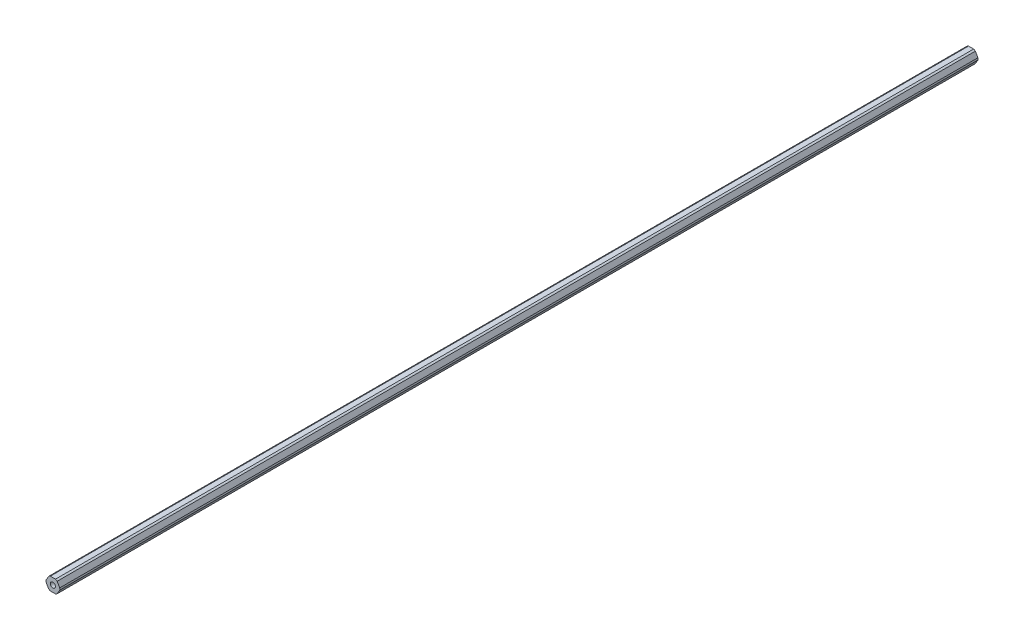
ISO-10303-21;
HEADER;
FILE_DESCRIPTION(('STEP AP214'),'2;1');
FILE_NAME('part.step','',(''),(''),'','','');
FILE_SCHEMA(('AUTOMOTIVE_DESIGN { 1 0 10303 214 1 1 1 1 }'));
ENDSEC;
DATA;
#1=APPLICATION_CONTEXT('core data for automotive mechanical design processes');
#2=APPLICATION_PROTOCOL_DEFINITION('international standard','automotive_design',2000,#1);
#3=PRODUCT_CONTEXT('',#1,'mechanical');
#4=PRODUCT('Part','Part','',(#3));
#5=PRODUCT_RELATED_PRODUCT_CATEGORY('part','',(#4));
#6=PRODUCT_DEFINITION_FORMATION('','',#4);
#7=PRODUCT_DEFINITION_CONTEXT('part definition',#1,'design');
#8=PRODUCT_DEFINITION('design','',#6,#7);
#9=PRODUCT_DEFINITION_SHAPE('','',#8);
#10=(LENGTH_UNIT() NAMED_UNIT(*) SI_UNIT(.MILLI.,.METRE.));
#11=(NAMED_UNIT(*) PLANE_ANGLE_UNIT() SI_UNIT($,.RADIAN.));
#12=(NAMED_UNIT(*) SI_UNIT($,.STERADIAN.) SOLID_ANGLE_UNIT());
#13=UNCERTAINTY_MEASURE_WITH_UNIT(LENGTH_MEASURE(1.E-05),#10,'distance_accuracy_value','');
#14=(GEOMETRIC_REPRESENTATION_CONTEXT(3) GLOBAL_UNCERTAINTY_ASSIGNED_CONTEXT((#13)) GLOBAL_UNIT_ASSIGNED_CONTEXT((#10,
#11,#12)) REPRESENTATION_CONTEXT('',''));
#15=CARTESIAN_POINT('',(0.,0.,0.));
#16=DIRECTION('',(0.,0.,1.));
#17=DIRECTION('',(1.,0.,0.));
#18=AXIS2_PLACEMENT_3D('',#15,#16,#17);
#19=CARTESIAN_POINT('',(0.,0.,-457.2));
#20=DIRECTION('',(0.,0.,1.));
#21=DIRECTION('',(1.,0.,0.));
#22=AXIS2_PLACEMENT_3D('',#19,#20,#21);
#23=CYLINDRICAL_SURFACE('',#22,6.87);
#24=DIRECTION('',(0.,0.,1.));
#25=VECTOR('',#24,1.);
#26=CARTESIAN_POINT('',(6.80102150534208,0.97108520937895,457.2));
#27=LINE('',#26,#25);
#28=CARTESIAN_POINT('',(6.80102150534208,0.971085209378948,-457.2));
#29=VERTEX_POINT('',#28);
#30=CARTESIAN_POINT('',(6.80102150534208,0.971085209378948,457.2));
#31=VERTEX_POINT('',#30);
#32=EDGE_CURVE('E123',#29,#31,#27,.T.);
#33=ORIENTED_EDGE('',*,*,#32,.T.);
#34=CARTESIAN_POINT('',(0.,0.,457.2));
#35=DIRECTION('',(0.,0.,1.));
#36=DIRECTION('',(1.,0.,0.));
#37=AXIS2_PLACEMENT_3D('',#34,#35,#36);
#38=CIRCLE('',#37,6.87);
#39=CARTESIAN_POINT('',(6.80102150534208,-0.971085209378954,457.2));
#40=VERTEX_POINT('',#39);
#41=EDGE_CURVE('E118',#31,#40,#38,.F.);
#42=ORIENTED_EDGE('',*,*,#41,.T.);
#43=DIRECTION('',(0.,0.,1.));
#44=VECTOR('',#43,1.);
#45=CARTESIAN_POINT('',(6.80102150534208,-0.971085209378955,457.2));
#46=LINE('',#45,#44);
#47=CARTESIAN_POINT('',(6.80102150534208,-0.971085209378953,-457.2));
#48=VERTEX_POINT('',#47);
#49=EDGE_CURVE('E120',#40,#48,#46,.F.);
#50=ORIENTED_EDGE('',*,*,#49,.T.);
#51=CARTESIAN_POINT('',(0.,0.,-457.2));
#52=DIRECTION('',(0.,0.,1.));
#53=DIRECTION('',(1.,0.,0.));
#54=AXIS2_PLACEMENT_3D('',#51,#52,#53);
#55=CIRCLE('',#54,6.87);
#56=EDGE_CURVE('E21',#48,#29,#55,.T.);
#57=ORIENTED_EDGE('',*,*,#56,.T.);
#58=EDGE_LOOP('',(#33,#42,#50,#57));
#59=FACE_BOUND('',#58,.T.);
#60=ADVANCED_FACE('F18',(#59),#23,.T.);
#61=CARTESIAN_POINT('',(3.68083890619154,6.3754,457.2));
#62=DIRECTION('',(0.,-1.,0.));
#63=DIRECTION('',(1.,0.,0.));
#64=AXIS2_PLACEMENT_3D('',#61,#62,#63);
#65=PLANE('',#64);
#66=DIRECTION('',(1.,0.,0.));
#67=VECTOR('',#66,1.);
#68=CARTESIAN_POINT('',(0.,6.3754,-457.2));
#69=LINE('',#68,#67);
#70=CARTESIAN_POINT('',(2.55952629210953,6.37540000000001,-457.2));
#71=VERTEX_POINT('',#70);
#72=CARTESIAN_POINT('',(-2.55952629210953,6.37540000000001,-457.2));
#73=VERTEX_POINT('',#72);
#74=EDGE_CURVE('E145',#71,#73,#69,.F.);
#75=ORIENTED_EDGE('',*,*,#74,.T.);
#76=DIRECTION('',(0.,0.,1.));
#77=VECTOR('',#76,1.);
#78=CARTESIAN_POINT('',(-2.55952629210953,6.37540000000001,-457.2));
#79=LINE('',#78,#77);
#80=CARTESIAN_POINT('',(-2.55952629210953,6.37540000000001,457.2));
#81=VERTEX_POINT('',#80);
#82=EDGE_CURVE('E128',#81,#73,#79,.F.);
#83=ORIENTED_EDGE('',*,*,#82,.F.);
#84=DIRECTION('',(1.,0.,0.));
#85=VECTOR('',#84,1.);
#86=CARTESIAN_POINT('',(0.,6.3754,457.2));
#87=LINE('',#86,#85);
#88=CARTESIAN_POINT('',(2.55952629210953,6.37540000000001,457.2));
#89=VERTEX_POINT('',#88);
#90=EDGE_CURVE('E167',#89,#81,#87,.F.);
#91=ORIENTED_EDGE('',*,*,#90,.F.);
#92=DIRECTION('',(0.,0.,1.));
#93=VECTOR('',#92,1.);
#94=CARTESIAN_POINT('',(2.55952629210953,6.37540000000001,-457.2));
#95=LINE('',#94,#93);
#96=EDGE_CURVE('E174',#71,#89,#95,.T.);
#97=ORIENTED_EDGE('',*,*,#96,.F.);
#98=EDGE_LOOP('',(#75,#83,#91,#97));
#99=FACE_BOUND('',#98,.T.);
#100=ADVANCED_FACE('F237',(#99),#65,.F.);
#101=CARTESIAN_POINT('',(0.,0.,-457.2));
#102=DIRECTION('',(0.,0.,1.));
#103=DIRECTION('',(1.,0.,0.));
#104=AXIS2_PLACEMENT_3D('',#101,#102,#103);
#105=CYLINDRICAL_SURFACE('',#104,6.87);
#106=DIRECTION('',(0.,0.,1.));
#107=VECTOR('',#106,1.);
#108=CARTESIAN_POINT('',(-4.24149521323255,5.40431479062104,457.2));
#109=LINE('',#108,#107);
#110=CARTESIAN_POINT('',(-4.24149521323255,5.40431479062105,-457.2));
#111=VERTEX_POINT('',#110);
#112=CARTESIAN_POINT('',(-4.24149521323255,5.40431479062105,457.2));
#113=VERTEX_POINT('',#112);
#114=EDGE_CURVE('E199',#111,#113,#109,.T.);
#115=ORIENTED_EDGE('',*,*,#114,.T.);
#116=CARTESIAN_POINT('',(0.,0.,457.2));
#117=DIRECTION('',(0.,0.,1.));
#118=DIRECTION('',(1.,0.,0.));
#119=AXIS2_PLACEMENT_3D('',#116,#117,#118);
#120=CIRCLE('',#119,6.87);
#121=EDGE_CURVE('E166',#81,#113,#120,.T.);
#122=ORIENTED_EDGE('',*,*,#121,.F.);
#123=ORIENTED_EDGE('',*,*,#82,.T.);
#124=CARTESIAN_POINT('',(0.,0.,-457.2));
#125=DIRECTION('',(0.,0.,1.));
#126=DIRECTION('',(1.,0.,0.));
#127=AXIS2_PLACEMENT_3D('',#124,#125,#126);
#128=CIRCLE('',#127,6.87);
#129=EDGE_CURVE('E150',#73,#111,#128,.T.);
#130=ORIENTED_EDGE('',*,*,#129,.T.);
#131=EDGE_LOOP('',(#115,#122,#123,#130));
#132=FACE_BOUND('',#131,.T.);
#133=ADVANCED_FACE('F241',(#132),#105,.T.);
#134=CARTESIAN_POINT('',(-3.68083890619154,6.3754,457.2));
#135=DIRECTION('',(0.866025403784439,-0.5,0.));
#136=DIRECTION('',(0.5,0.866025403784439,0.));
#137=AXIS2_PLACEMENT_3D('',#134,#135,#136);
#138=PLANE('',#137);
#139=DIRECTION('',(-0.5,-0.866025403784439,0.));
#140=VECTOR('',#139,1.);
#141=CARTESIAN_POINT('',(-4.24149521323255,5.40431479062104,-457.2));
#142=LINE('',#141,#140);
#143=CARTESIAN_POINT('',(-6.80102150534208,0.971085209378961,-457.2));
#144=VERTEX_POINT('',#143);
#145=EDGE_CURVE('E222',#111,#144,#142,.T.);
#146=ORIENTED_EDGE('',*,*,#145,.T.);
#147=DIRECTION('',(0.,0.,1.));
#148=VECTOR('',#147,1.);
#149=CARTESIAN_POINT('',(-6.80102150534208,0.971085209378959,-457.2));
#150=LINE('',#149,#148);
#151=CARTESIAN_POINT('',(-6.80102150534208,0.971085209378961,457.2));
#152=VERTEX_POINT('',#151);
#153=EDGE_CURVE('E196',#152,#144,#150,.F.);
#154=ORIENTED_EDGE('',*,*,#153,.F.);
#155=DIRECTION('',(-0.5,-0.866025403784439,0.));
#156=VECTOR('',#155,1.);
#157=CARTESIAN_POINT('',(-4.24149521323255,5.40431479062104,457.2));
#158=LINE('',#157,#156);
#159=EDGE_CURVE('E163',#113,#152,#158,.T.);
#160=ORIENTED_EDGE('',*,*,#159,.F.);
#161=ORIENTED_EDGE('',*,*,#114,.F.);
#162=EDGE_LOOP('',(#146,#154,#160,#161));
#163=FACE_BOUND('',#162,.T.);
#164=ADVANCED_FACE('F247',(#163),#138,.F.);
#165=CARTESIAN_POINT('',(0.,0.,-457.2));
#166=DIRECTION('',(0.,0.,1.));
#167=DIRECTION('',(1.,0.,0.));
#168=AXIS2_PLACEMENT_3D('',#165,#166,#167);
#169=CYLINDRICAL_SURFACE('',#168,6.87);
#170=DIRECTION('',(0.,0.,1.));
#171=VECTOR('',#170,1.);
#172=CARTESIAN_POINT('',(-6.80102150534208,-0.971085209378956,457.2));
#173=LINE('',#172,#171);
#174=CARTESIAN_POINT('',(-6.80102150534208,-0.971085209378956,-457.2));
#175=VERTEX_POINT('',#174);
#176=CARTESIAN_POINT('',(-6.80102150534208,-0.971085209378955,457.2));
#177=VERTEX_POINT('',#176);
#178=EDGE_CURVE('E192',#175,#177,#173,.T.);
#179=ORIENTED_EDGE('',*,*,#178,.T.);
#180=CARTESIAN_POINT('',(0.,0.,457.2));
#181=DIRECTION('',(0.,0.,1.));
#182=DIRECTION('',(1.,0.,0.));
#183=AXIS2_PLACEMENT_3D('',#180,#181,#182);
#184=CIRCLE('',#183,6.87);
#185=EDGE_CURVE('E162',#152,#177,#184,.T.);
#186=ORIENTED_EDGE('',*,*,#185,.F.);
#187=ORIENTED_EDGE('',*,*,#153,.T.);
#188=CARTESIAN_POINT('',(0.,0.,-457.2));
#189=DIRECTION('',(0.,0.,1.));
#190=DIRECTION('',(1.,0.,0.));
#191=AXIS2_PLACEMENT_3D('',#188,#189,#190);
#192=CIRCLE('',#191,6.87);
#193=EDGE_CURVE('E219',#144,#175,#192,.T.);
#194=ORIENTED_EDGE('',*,*,#193,.T.);
#195=EDGE_LOOP('',(#179,#186,#187,#194));
#196=FACE_BOUND('',#195,.T.);
#197=ADVANCED_FACE('F251',(#196),#169,.T.);
#198=CARTESIAN_POINT('',(-7.36167781238308,0.,457.2));
#199=DIRECTION('',(0.866025403784439,0.5,0.));
#200=DIRECTION('',(-0.5,0.866025403784439,0.));
#201=AXIS2_PLACEMENT_3D('',#198,#199,#200);
#202=PLANE('',#201);
#203=DIRECTION('',(0.5,-0.866025403784438,0.));
#204=VECTOR('',#203,1.);
#205=CARTESIAN_POINT('',(-6.80102150534208,-0.971085209378956,-457.2));
#206=LINE('',#205,#204);
#207=CARTESIAN_POINT('',(-4.24149521323254,-5.40431479062105,-457.2));
#208=VERTEX_POINT('',#207);
#209=EDGE_CURVE('E218',#175,#208,#206,.T.);
#210=ORIENTED_EDGE('',*,*,#209,.T.);
#211=DIRECTION('',(0.,0.,1.));
#212=VECTOR('',#211,1.);
#213=CARTESIAN_POINT('',(-4.24149521323255,-5.40431479062105,-457.2));
#214=LINE('',#213,#212);
#215=CARTESIAN_POINT('',(-4.24149521323255,-5.40431479062105,457.2));
#216=VERTEX_POINT('',#215);
#217=EDGE_CURVE('E189',#216,#208,#214,.F.);
#218=ORIENTED_EDGE('',*,*,#217,.F.);
#219=DIRECTION('',(0.5,-0.866025403784439,0.));
#220=VECTOR('',#219,1.);
#221=CARTESIAN_POINT('',(-6.80102150534208,-0.971085209378956,457.2));
#222=LINE('',#221,#220);
#223=EDGE_CURVE('E159',#177,#216,#222,.T.);
#224=ORIENTED_EDGE('',*,*,#223,.F.);
#225=ORIENTED_EDGE('',*,*,#178,.F.);
#226=EDGE_LOOP('',(#210,#218,#224,#225));
#227=FACE_BOUND('',#226,.T.);
#228=ADVANCED_FACE('F257',(#227),#202,.F.);
#229=CARTESIAN_POINT('',(0.,0.,-457.2));
#230=DIRECTION('',(0.,0.,1.));
#231=DIRECTION('',(1.,0.,0.));
#232=AXIS2_PLACEMENT_3D('',#229,#230,#231);
#233=CYLINDRICAL_SURFACE('',#232,6.87);
#234=DIRECTION('',(0.,0.,1.));
#235=VECTOR('',#234,1.);
#236=CARTESIAN_POINT('',(-2.55952629210953,-6.3754,457.2));
#237=LINE('',#236,#235);
#238=CARTESIAN_POINT('',(-2.55952629210953,-6.3754,-457.2));
#239=VERTEX_POINT('',#238);
#240=CARTESIAN_POINT('',(-2.55952629210953,-6.3754,457.2));
#241=VERTEX_POINT('',#240);
#242=EDGE_CURVE('E185',#239,#241,#237,.T.);
#243=ORIENTED_EDGE('',*,*,#242,.T.);
#244=CARTESIAN_POINT('',(0.,0.,457.2));
#245=DIRECTION('',(0.,0.,1.));
#246=DIRECTION('',(1.,0.,0.));
#247=AXIS2_PLACEMENT_3D('',#244,#245,#246);
#248=CIRCLE('',#247,6.87);
#249=EDGE_CURVE('E158',#216,#241,#248,.T.);
#250=ORIENTED_EDGE('',*,*,#249,.F.);
#251=ORIENTED_EDGE('',*,*,#217,.T.);
#252=CARTESIAN_POINT('',(0.,0.,-457.2));
#253=DIRECTION('',(0.,0.,1.));
#254=DIRECTION('',(1.,0.,0.));
#255=AXIS2_PLACEMENT_3D('',#252,#253,#254);
#256=CIRCLE('',#255,6.87);
#257=EDGE_CURVE('E215',#208,#239,#256,.T.);
#258=ORIENTED_EDGE('',*,*,#257,.T.);
#259=EDGE_LOOP('',(#243,#250,#251,#258));
#260=FACE_BOUND('',#259,.T.);
#261=ADVANCED_FACE('F262',(#260),#233,.T.);
#262=CARTESIAN_POINT('',(-3.68083890619154,-6.3754,457.2));
#263=DIRECTION('',(0.,1.,0.));
#264=DIRECTION('',(0.,0.,1.));
#265=AXIS2_PLACEMENT_3D('',#262,#263,#264);
#266=PLANE('',#265);
#267=DIRECTION('',(1.,0.,0.));
#268=VECTOR('',#267,1.);
#269=CARTESIAN_POINT('',(0.,-6.3754,-457.2));
#270=LINE('',#269,#268);
#271=CARTESIAN_POINT('',(2.55952629210953,-6.3754,-457.2));
#272=VERTEX_POINT('',#271);
#273=EDGE_CURVE('E214',#239,#272,#270,.T.);
#274=ORIENTED_EDGE('',*,*,#273,.T.);
#275=DIRECTION('',(0.,0.,1.));
#276=VECTOR('',#275,1.);
#277=CARTESIAN_POINT('',(2.55952629210953,-6.3754,-457.2));
#278=LINE('',#277,#276);
#279=CARTESIAN_POINT('',(2.55952629210953,-6.3754,457.2));
#280=VERTEX_POINT('',#279);
#281=EDGE_CURVE('E137',#280,#272,#278,.F.);
#282=ORIENTED_EDGE('',*,*,#281,.F.);
#283=DIRECTION('',(1.,0.,0.));
#284=VECTOR('',#283,1.);
#285=CARTESIAN_POINT('',(0.,-6.3754,457.2));
#286=LINE('',#285,#284);
#287=EDGE_CURVE('E152',#241,#280,#286,.T.);
#288=ORIENTED_EDGE('',*,*,#287,.F.);
#289=ORIENTED_EDGE('',*,*,#242,.F.);
#290=EDGE_LOOP('',(#274,#282,#288,#289));
#291=FACE_BOUND('',#290,.T.);
#292=ADVANCED_FACE('F267',(#291),#266,.F.);
#293=CARTESIAN_POINT('',(0.,0.,-457.2));
#294=DIRECTION('',(0.,0.,1.));
#295=DIRECTION('',(1.,0.,0.));
#296=AXIS2_PLACEMENT_3D('',#293,#294,#295);
#297=CYLINDRICAL_SURFACE('',#296,6.87);
#298=ORIENTED_EDGE('',*,*,#281,.T.);
#299=CARTESIAN_POINT('',(0.,0.,-457.2));
#300=DIRECTION('',(0.,0.,1.));
#301=DIRECTION('',(1.,0.,0.));
#302=AXIS2_PLACEMENT_3D('',#299,#300,#301);
#303=CIRCLE('',#302,6.87);
#304=CARTESIAN_POINT('',(4.24149521323254,-5.40431479062105,-457.2));
#305=VERTEX_POINT('',#304);
#306=EDGE_CURVE('E211',#272,#305,#303,.T.);
#307=ORIENTED_EDGE('',*,*,#306,.T.);
#308=DIRECTION('',(0.,0.,1.));
#309=VECTOR('',#308,1.);
#310=CARTESIAN_POINT('',(4.24149521323254,-5.40431479062105,457.2));
#311=LINE('',#310,#309);
#312=CARTESIAN_POINT('',(4.24149521323254,-5.40431479062105,457.2));
#313=VERTEX_POINT('',#312);
#314=EDGE_CURVE('E136',#305,#313,#311,.T.);
#315=ORIENTED_EDGE('',*,*,#314,.T.);
#316=CARTESIAN_POINT('',(0.,0.,457.2));
#317=DIRECTION('',(0.,0.,1.));
#318=DIRECTION('',(1.,0.,0.));
#319=AXIS2_PLACEMENT_3D('',#316,#317,#318);
#320=CIRCLE('',#319,6.87);
#321=EDGE_CURVE('E142',#280,#313,#320,.T.);
#322=ORIENTED_EDGE('',*,*,#321,.F.);
#323=EDGE_LOOP('',(#298,#307,#315,#322));
#324=FACE_BOUND('',#323,.T.);
#325=ADVANCED_FACE('F270',(#324),#297,.T.);
#326=CARTESIAN_POINT('',(3.68083890619154,-6.3754,457.2));
#327=DIRECTION('',(-0.866025403784439,0.5,0.));
#328=DIRECTION('',(-0.5,-0.866025403784439,0.));
#329=AXIS2_PLACEMENT_3D('',#326,#327,#328);
#330=PLANE('',#329);
#331=DIRECTION('',(0.5,0.866025403784439,0.));
#332=VECTOR('',#331,1.);
#333=CARTESIAN_POINT('',(4.24149521323254,-5.40431479062105,-457.2));
#334=LINE('',#333,#332);
#335=EDGE_CURVE('E134',#305,#48,#334,.T.);
#336=ORIENTED_EDGE('',*,*,#335,.T.);
#337=ORIENTED_EDGE('',*,*,#49,.F.);
#338=DIRECTION('',(0.5,0.866025403784439,0.));
#339=VECTOR('',#338,1.);
#340=CARTESIAN_POINT('',(4.24149521323254,-5.40431479062105,457.2));
#341=LINE('',#340,#339);
#342=EDGE_CURVE('E132',#313,#40,#341,.T.);
#343=ORIENTED_EDGE('',*,*,#342,.F.);
#344=ORIENTED_EDGE('',*,*,#314,.F.);
#345=EDGE_LOOP('',(#336,#337,#343,#344));
#346=FACE_BOUND('',#345,.T.);
#347=ADVANCED_FACE('F131',(#346),#330,.F.);
#348=CARTESIAN_POINT('',(7.36167781238308,0.,457.2));
#349=DIRECTION('',(-0.866025403784439,-0.5,0.));
#350=DIRECTION('',(0.5,-0.866025403784439,0.));
#351=AXIS2_PLACEMENT_3D('',#348,#349,#350);
#352=PLANE('',#351);
#353=DIRECTION('',(-0.5,0.866025403784438,0.));
#354=VECTOR('',#353,1.);
#355=CARTESIAN_POINT('',(6.80102150534208,0.97108520937895,-457.2));
#356=LINE('',#355,#354);
#357=CARTESIAN_POINT('',(4.24149521323254,5.40431479062105,-457.2));
#358=VERTEX_POINT('',#357);
#359=EDGE_CURVE('E210',#29,#358,#356,.T.);
#360=ORIENTED_EDGE('',*,*,#359,.T.);
#361=DIRECTION('',(0.,0.,1.));
#362=VECTOR('',#361,1.);
#363=CARTESIAN_POINT('',(4.24149521323254,5.40431479062105,-457.2));
#364=LINE('',#363,#362);
#365=CARTESIAN_POINT('',(4.24149521323254,5.40431479062105,457.2));
#366=VERTEX_POINT('',#365);
#367=EDGE_CURVE('E36',#366,#358,#364,.F.);
#368=ORIENTED_EDGE('',*,*,#367,.F.);
#369=DIRECTION('',(-0.5,0.866025403784438,0.));
#370=VECTOR('',#369,1.);
#371=CARTESIAN_POINT('',(6.80102150534208,0.97108520937895,457.2));
#372=LINE('',#371,#370);
#373=EDGE_CURVE('E171',#31,#366,#372,.T.);
#374=ORIENTED_EDGE('',*,*,#373,.F.);
#375=ORIENTED_EDGE('',*,*,#32,.F.);
#376=EDGE_LOOP('',(#360,#368,#374,#375));
#377=FACE_BOUND('',#376,.T.);
#378=ADVANCED_FACE('F282',(#377),#352,.F.);
#379=CARTESIAN_POINT('',(0.,0.,-457.2));
#380=DIRECTION('',(0.,0.,1.));
#381=DIRECTION('',(1.,0.,0.));
#382=AXIS2_PLACEMENT_3D('',#379,#380,#381);
#383=CYLINDRICAL_SURFACE('',#382,6.87);
#384=ORIENTED_EDGE('',*,*,#96,.T.);
#385=CARTESIAN_POINT('',(0.,0.,457.2));
#386=DIRECTION('',(0.,0.,1.));
#387=DIRECTION('',(1.,0.,0.));
#388=AXIS2_PLACEMENT_3D('',#385,#386,#387);
#389=CIRCLE('',#388,6.87);
#390=EDGE_CURVE('E170',#366,#89,#389,.T.);
#391=ORIENTED_EDGE('',*,*,#390,.F.);
#392=ORIENTED_EDGE('',*,*,#367,.T.);
#393=CARTESIAN_POINT('',(0.,0.,-457.2));
#394=DIRECTION('',(0.,0.,1.));
#395=DIRECTION('',(1.,0.,0.));
#396=AXIS2_PLACEMENT_3D('',#393,#394,#395);
#397=CIRCLE('',#396,6.87);
#398=EDGE_CURVE('E208',#358,#71,#397,.T.);
#399=ORIENTED_EDGE('',*,*,#398,.T.);
#400=EDGE_LOOP('',(#384,#391,#392,#399));
#401=FACE_BOUND('',#400,.T.);
#402=ADVANCED_FACE('F284',(#401),#383,.T.);
#403=CARTESIAN_POINT('',(0.,0.,457.2));
#404=DIRECTION('',(0.,0.,1.));
#405=DIRECTION('',(1.,0.,0.));
#406=AXIS2_PLACEMENT_3D('',#403,#404,#405);
#407=PLANE('',#406);
#408=ORIENTED_EDGE('',*,*,#342,.T.);
#409=ORIENTED_EDGE('',*,*,#41,.F.);
#410=ORIENTED_EDGE('',*,*,#373,.T.);
#411=ORIENTED_EDGE('',*,*,#390,.T.);
#412=ORIENTED_EDGE('',*,*,#90,.T.);
#413=ORIENTED_EDGE('',*,*,#121,.T.);
#414=ORIENTED_EDGE('',*,*,#159,.T.);
#415=ORIENTED_EDGE('',*,*,#185,.T.);
#416=ORIENTED_EDGE('',*,*,#223,.T.);
#417=ORIENTED_EDGE('',*,*,#249,.T.);
#418=ORIENTED_EDGE('',*,*,#287,.T.);
#419=ORIENTED_EDGE('',*,*,#321,.T.);
#420=EDGE_LOOP('',(#408,#409,#410,#411,#412,#413,#414,#415,#416,#417,#418,#419));
#421=FACE_BOUND('',#420,.T.);
#422=CARTESIAN_POINT('',(0.,0.,457.2));
#423=DIRECTION('',(0.,0.,1.));
#424=DIRECTION('',(1.,0.,0.));
#425=AXIS2_PLACEMENT_3D('',#422,#423,#424);
#426=CIRCLE('',#425,2.55);
#427=CARTESIAN_POINT('',(2.55,0.,457.2));
#428=VERTEX_POINT('',#427);
#429=EDGE_CURVE('E27',#428,#428,#426,.F.);
#430=ORIENTED_EDGE('',*,*,#429,.T.);
#431=EDGE_LOOP('',(#430));
#432=FACE_BOUND('',#431,.T.);
#433=ADVANCED_FACE('F139',(#421,#432),#407,.T.);
#434=CARTESIAN_POINT('',(0.,0.,-457.2));
#435=DIRECTION('',(0.,0.,1.));
#436=DIRECTION('',(1.,0.,0.));
#437=AXIS2_PLACEMENT_3D('',#434,#435,#436);
#438=PLANE('',#437);
#439=ORIENTED_EDGE('',*,*,#359,.F.);
#440=ORIENTED_EDGE('',*,*,#56,.F.);
#441=ORIENTED_EDGE('',*,*,#335,.F.);
#442=ORIENTED_EDGE('',*,*,#306,.F.);
#443=ORIENTED_EDGE('',*,*,#273,.F.);
#444=ORIENTED_EDGE('',*,*,#257,.F.);
#445=ORIENTED_EDGE('',*,*,#209,.F.);
#446=ORIENTED_EDGE('',*,*,#193,.F.);
#447=ORIENTED_EDGE('',*,*,#145,.F.);
#448=ORIENTED_EDGE('',*,*,#129,.F.);
#449=ORIENTED_EDGE('',*,*,#74,.F.);
#450=ORIENTED_EDGE('',*,*,#398,.F.);
#451=EDGE_LOOP('',(#439,#440,#441,#442,#443,#444,#445,#446,#447,#448,#449,#450));
#452=FACE_BOUND('',#451,.T.);
#453=CARTESIAN_POINT('',(0.,0.,-457.2));
#454=DIRECTION('',(0.,0.,1.));
#455=DIRECTION('',(1.,0.,0.));
#456=AXIS2_PLACEMENT_3D('',#453,#454,#455);
#457=CIRCLE('',#456,2.55);
#458=CARTESIAN_POINT('',(2.55,0.,-457.2));
#459=VERTEX_POINT('',#458);
#460=EDGE_CURVE('E11',#459,#459,#457,.T.);
#461=ORIENTED_EDGE('',*,*,#460,.T.);
#462=EDGE_LOOP('',(#461));
#463=FACE_BOUND('',#462,.T.);
#464=ADVANCED_FACE('F274',(#452,#463),#438,.F.);
#465=CARTESIAN_POINT('',(0.,0.,-457.2));
#466=DIRECTION('',(0.,0.,1.));
#467=DIRECTION('',(1.,0.,0.));
#468=AXIS2_PLACEMENT_3D('',#465,#466,#467);
#469=CYLINDRICAL_SURFACE('',#468,2.55);
#470=ORIENTED_EDGE('',*,*,#429,.F.);
#471=EDGE_LOOP('',(#470));
#472=FACE_BOUND('',#471,.T.);
#473=ORIENTED_EDGE('',*,*,#460,.F.);
#474=EDGE_LOOP('',(#473));
#475=FACE_BOUND('',#474,.T.);
#476=ADVANCED_FACE('F293',(#472,#475),#469,.F.);
#477=CLOSED_SHELL('',(#60,#100,#133,#164,#197,#228,#261,#292,#325,#347,#378,#402,#433,#464,#476));
#478=MANIFOLD_SOLID_BREP('B1',#477);
#479=ADVANCED_BREP_SHAPE_REPRESENTATION('',(#18,#478),#14);
#480=SHAPE_DEFINITION_REPRESENTATION(#9,#479);
ENDSEC;
END-ISO-10303-21;
